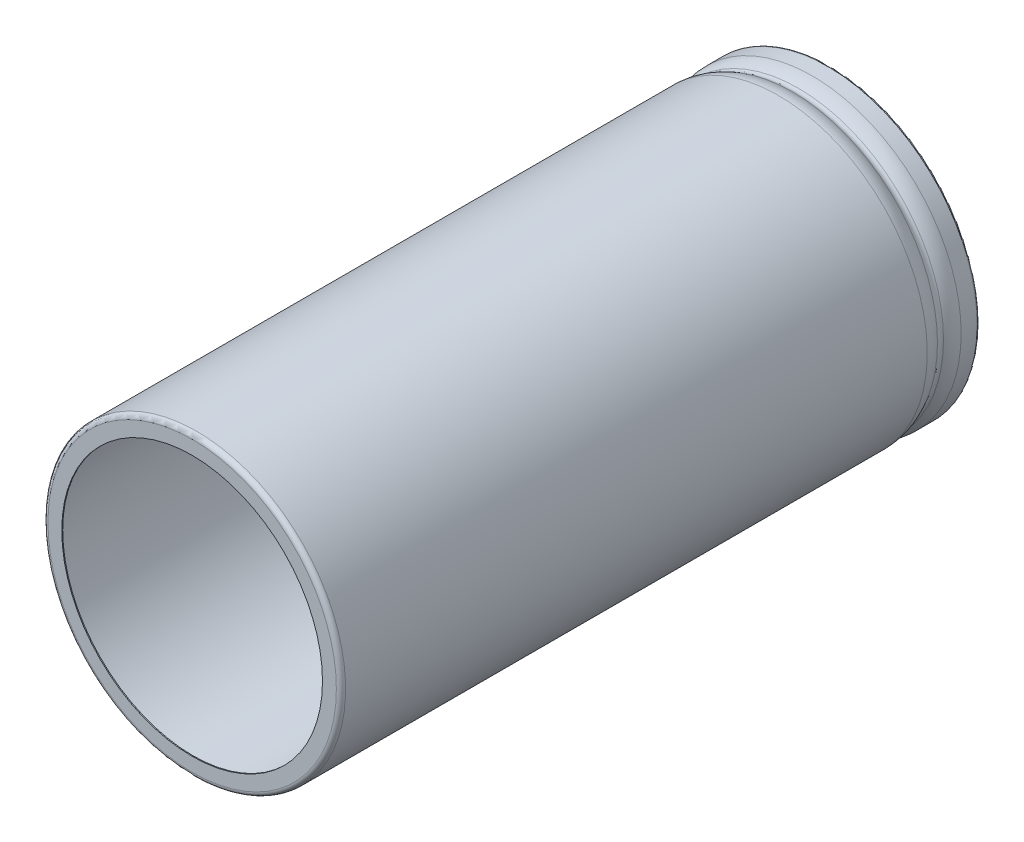
ISO-10303-21;
HEADER;
FILE_DESCRIPTION(('STEP AP214'),'2;1');
FILE_NAME('part.step','',(''),(''),'','','');
FILE_SCHEMA(('AUTOMOTIVE_DESIGN { 1 0 10303 214 1 1 1 1 }'));
ENDSEC;
DATA;
#1=APPLICATION_CONTEXT('core data for automotive mechanical design processes');
#2=APPLICATION_PROTOCOL_DEFINITION('international standard','automotive_design',2000,#1);
#3=PRODUCT_CONTEXT('',#1,'mechanical');
#4=PRODUCT('Part','Part','',(#3));
#5=PRODUCT_RELATED_PRODUCT_CATEGORY('part','',(#4));
#6=PRODUCT_DEFINITION_FORMATION('','',#4);
#7=PRODUCT_DEFINITION_CONTEXT('part definition',#1,'design');
#8=PRODUCT_DEFINITION('design','',#6,#7);
#9=PRODUCT_DEFINITION_SHAPE('','',#8);
#10=(LENGTH_UNIT() NAMED_UNIT(*) SI_UNIT(.MILLI.,.METRE.));
#11=(NAMED_UNIT(*) PLANE_ANGLE_UNIT() SI_UNIT($,.RADIAN.));
#12=(NAMED_UNIT(*) SI_UNIT($,.STERADIAN.) SOLID_ANGLE_UNIT());
#13=UNCERTAINTY_MEASURE_WITH_UNIT(LENGTH_MEASURE(1.E-05),#10,'distance_accuracy_value','');
#14=(GEOMETRIC_REPRESENTATION_CONTEXT(3) GLOBAL_UNCERTAINTY_ASSIGNED_CONTEXT((#13)) GLOBAL_UNIT_ASSIGNED_CONTEXT((#10,
#11,#12)) REPRESENTATION_CONTEXT('',''));
#15=CARTESIAN_POINT('',(0.,0.,0.));
#16=DIRECTION('',(0.,0.,1.));
#17=DIRECTION('',(1.,0.,0.));
#18=AXIS2_PLACEMENT_3D('',#15,#16,#17);
#19=CARTESIAN_POINT('',(0.,16.,-64.4));
#20=CARTESIAN_POINT('',(0.,15.,-65.15));
#21=CARTESIAN_POINT('',(0.,16.,-65.9));
#22=B_SPLINE_CURVE_WITH_KNOTS('',2,(#19,#20,#21),.UNSPECIFIED.,.F.,.F.,(3,3),(0.,1.),.UNSPECIFIED.);
#23=CARTESIAN_POINT('',(0.,0.,0.));
#24=DIRECTION('',(0.,0.,1.));
#25=AXIS1_PLACEMENT('',#23,#24);
#26=SURFACE_OF_REVOLUTION('',#22,#25);
#27=CARTESIAN_POINT('',(0.,0.,-65.4764362746467));
#28=DIRECTION('',(0.,0.,1.));
#29=DIRECTION('',(1.,0.,0.));
#30=AXIS2_PLACEMENT_3D('',#27,#28,#29);
#31=CIRCLE('',#30,15.594720570138);
#32=CARTESIAN_POINT('',(15.594720570138,0.,-65.4764362746467));
#33=VERTEX_POINT('',#32);
#34=EDGE_CURVE('E54',#33,#33,#31,.F.);
#35=ORIENTED_EDGE('',*,*,#34,.T.);
#36=EDGE_LOOP('',(#35));
#37=FACE_BOUND('',#36,.T.);
#38=CARTESIAN_POINT('',(0.,0.,-64.8235637253477));
#39=DIRECTION('',(0.,0.,1.));
#40=DIRECTION('',(1.,0.,0.));
#41=AXIS2_PLACEMENT_3D('',#38,#39,#40);
#42=CIRCLE('',#41,15.5947205701413);
#43=CARTESIAN_POINT('',(15.5947205701413,0.,-64.8235637253477));
#44=VERTEX_POINT('',#43);
#45=EDGE_CURVE('E57',#44,#44,#42,.T.);
#46=ORIENTED_EDGE('',*,*,#45,.T.);
#47=EDGE_LOOP('',(#46));
#48=FACE_BOUND('',#47,.T.);
#49=ADVANCED_FACE('F31',(#37,#48),#26,.T.);
#50=CARTESIAN_POINT('',(0.,0.,0.));
#51=DIRECTION('',(0.,0.,1.));
#52=DIRECTION('',(1.,0.,0.));
#53=AXIS2_PLACEMENT_3D('',#50,#51,#52);
#54=CYLINDRICAL_SURFACE('',#53,16.);
#55=CARTESIAN_POINT('',(0.,0.,-63.317766540171));
#56=DIRECTION('',(0.,0.,1.));
#57=DIRECTION('',(1.,0.,0.));
#58=AXIS2_PLACEMENT_3D('',#55,#56,#57);
#59=CIRCLE('',#58,16.);
#60=CARTESIAN_POINT('',(16.,0.,-63.317766540171));
#61=VERTEX_POINT('',#60);
#62=EDGE_CURVE('E51',#61,#61,#59,.F.);
#63=ORIENTED_EDGE('',*,*,#62,.T.);
#64=EDGE_LOOP('',(#63));
#65=FACE_BOUND('',#64,.T.);
#66=CARTESIAN_POINT('',(0.,0.,-0.500000000000001));
#67=DIRECTION('',(0.,0.,1.));
#68=DIRECTION('',(1.,0.,0.));
#69=AXIS2_PLACEMENT_3D('',#66,#67,#68);
#70=CIRCLE('',#69,16.);
#71=CARTESIAN_POINT('',(16.,0.,-0.500000000000001));
#72=VERTEX_POINT('',#71);
#73=EDGE_CURVE('E72',#72,#72,#70,.T.);
#74=ORIENTED_EDGE('',*,*,#73,.T.);
#75=EDGE_LOOP('',(#74));
#76=FACE_BOUND('',#75,.T.);
#77=ADVANCED_FACE('F131',(#65,#76),#54,.F.);
#78=CARTESIAN_POINT('',(0.,16.,0.));
#79=DIRECTION('',(0.,0.,1.));
#80=DIRECTION('',(1.,0.,0.));
#81=AXIS2_PLACEMENT_3D('',#78,#79,#80);
#82=PLANE('',#81);
#83=CARTESIAN_POINT('',(0.,0.,0.));
#84=DIRECTION('',(0.,0.,1.));
#85=DIRECTION('',(1.,0.,0.));
#86=AXIS2_PLACEMENT_3D('',#83,#84,#85);
#87=CIRCLE('',#86,15.5);
#88=CARTESIAN_POINT('',(15.5,0.,0.));
#89=VERTEX_POINT('',#88);
#90=EDGE_CURVE('E69',#89,#89,#87,.F.);
#91=ORIENTED_EDGE('',*,*,#90,.T.);
#92=EDGE_LOOP('',(#91));
#93=FACE_BOUND('',#92,.T.);
#94=CARTESIAN_POINT('',(0.,0.,0.));
#95=DIRECTION('',(0.,0.,1.));
#96=DIRECTION('',(1.,0.,0.));
#97=AXIS2_PLACEMENT_3D('',#94,#95,#96);
#98=CIRCLE('',#97,14.1);
#99=CARTESIAN_POINT('',(14.1,0.,0.));
#100=VERTEX_POINT('',#99);
#101=EDGE_CURVE('E87',#100,#100,#98,.T.);
#102=ORIENTED_EDGE('',*,*,#101,.T.);
#103=EDGE_LOOP('',(#102));
#104=FACE_BOUND('',#103,.T.);
#105=ADVANCED_FACE('F127',(#93,#104),#82,.F.);
#106=CARTESIAN_POINT('',(0.,0.,0.));
#107=DIRECTION('',(0.,0.,1.));
#108=DIRECTION('',(1.,0.,0.));
#109=AXIS2_PLACEMENT_3D('',#106,#107,#108);
#110=CYLINDRICAL_SURFACE('',#109,14.1);
#111=ORIENTED_EDGE('',*,*,#101,.F.);
#112=EDGE_LOOP('',(#111));
#113=FACE_BOUND('',#112,.T.);
#114=CARTESIAN_POINT('',(0.,0.,0.0999999999999997));
#115=DIRECTION('',(0.,0.,1.));
#116=DIRECTION('',(1.,0.,0.));
#117=AXIS2_PLACEMENT_3D('',#114,#115,#116);
#118=CIRCLE('',#117,14.1);
#119=CARTESIAN_POINT('',(14.1,0.,0.0999999999999997));
#120=VERTEX_POINT('',#119);
#121=EDGE_CURVE('E90',#120,#120,#118,.T.);
#122=ORIENTED_EDGE('',*,*,#121,.T.);
#123=EDGE_LOOP('',(#122));
#124=FACE_BOUND('',#123,.T.);
#125=ADVANCED_FACE('F123',(#113,#124),#110,.F.);
#126=CARTESIAN_POINT('',(0.,14.1,0.0999999999999997));
#127=DIRECTION('',(0.,0.,-1.));
#128=DIRECTION('',(-1.,0.,0.));
#129=AXIS2_PLACEMENT_3D('',#126,#127,#128);
#130=PLANE('',#129);
#131=CARTESIAN_POINT('',(0.,0.,0.0999999999999997));
#132=DIRECTION('',(0.,0.,-1.));
#133=DIRECTION('',(-1.,0.,0.));
#134=AXIS2_PLACEMENT_3D('',#131,#132,#133);
#135=CIRCLE('',#134,15.6);
#136=CARTESIAN_POINT('',(-15.6,0.,0.0999999999999997));
#137=VERTEX_POINT('',#136);
#138=EDGE_CURVE('E66',#137,#137,#135,.F.);
#139=ORIENTED_EDGE('',*,*,#138,.T.);
#140=EDGE_LOOP('',(#139));
#141=FACE_BOUND('',#140,.T.);
#142=ORIENTED_EDGE('',*,*,#121,.F.);
#143=EDGE_LOOP('',(#142));
#144=FACE_BOUND('',#143,.T.);
#145=ADVANCED_FACE('F120',(#141,#144),#130,.F.);
#146=CARTESIAN_POINT('',(0.,0.,0.));
#147=DIRECTION('',(0.,0.,1.));
#148=DIRECTION('',(1.,0.,0.));
#149=AXIS2_PLACEMENT_3D('',#146,#147,#148);
#150=CYLINDRICAL_SURFACE('',#149,16.1);
#151=CARTESIAN_POINT('',(0.,0.,-63.317766540171));
#152=DIRECTION('',(0.,0.,-1.));
#153=DIRECTION('',(-1.,0.,0.));
#154=AXIS2_PLACEMENT_3D('',#151,#152,#153);
#155=CIRCLE('',#154,16.1);
#156=CARTESIAN_POINT('',(-16.1,0.,-63.317766540171));
#157=VERTEX_POINT('',#156);
#158=EDGE_CURVE('E10',#157,#157,#155,.F.);
#159=ORIENTED_EDGE('',*,*,#158,.T.);
#160=EDGE_LOOP('',(#159));
#161=FACE_BOUND('',#160,.T.);
#162=CARTESIAN_POINT('',(0.,0.,-0.4));
#163=DIRECTION('',(0.,0.,-1.));
#164=DIRECTION('',(-1.,0.,0.));
#165=AXIS2_PLACEMENT_3D('',#162,#163,#164);
#166=CIRCLE('',#165,16.1);
#167=CARTESIAN_POINT('',(-16.1,0.,-0.4));
#168=VERTEX_POINT('',#167);
#169=EDGE_CURVE('E63',#168,#168,#166,.T.);
#170=ORIENTED_EDGE('',*,*,#169,.T.);
#171=EDGE_LOOP('',(#170));
#172=FACE_BOUND('',#171,.T.);
#173=ADVANCED_FACE('F115',(#161,#172),#150,.T.);
#174=CARTESIAN_POINT('',(0.,16.1,-65.9));
#175=CARTESIAN_POINT('',(0.,15.1,-65.15));
#176=CARTESIAN_POINT('',(0.,16.1,-64.4));
#177=B_SPLINE_CURVE_WITH_KNOTS('',2,(#174,#175,#176),.UNSPECIFIED.,.F.,.F.,(3,3),(0.,1.),.UNSPECIFIED.);
#178=CARTESIAN_POINT('',(0.,0.,0.));
#179=DIRECTION('',(0.,0.,1.));
#180=AXIS1_PLACEMENT('',#178,#179);
#181=SURFACE_OF_REVOLUTION('',#177,#180);
#182=CARTESIAN_POINT('',(0.,0.,-65.4764362746523));
#183=DIRECTION('',(0.,0.,1.));
#184=DIRECTION('',(1.,0.,0.));
#185=AXIS2_PLACEMENT_3D('',#182,#183,#184);
#186=CIRCLE('',#185,15.6947205701412);
#187=CARTESIAN_POINT('',(15.6947205701412,0.,-65.4764362746523));
#188=VERTEX_POINT('',#187);
#189=EDGE_CURVE('E42',#188,#188,#186,.T.);
#190=ORIENTED_EDGE('',*,*,#189,.T.);
#191=EDGE_LOOP('',(#190));
#192=FACE_BOUND('',#191,.T.);
#193=CARTESIAN_POINT('',(0.,0.,-64.8235637253533));
#194=DIRECTION('',(0.,0.,1.));
#195=DIRECTION('',(1.,0.,0.));
#196=AXIS2_PLACEMENT_3D('',#193,#194,#195);
#197=CIRCLE('',#196,15.694720570138);
#198=CARTESIAN_POINT('',(15.694720570138,0.,-64.8235637253533));
#199=VERTEX_POINT('',#198);
#200=EDGE_CURVE('E46',#199,#199,#197,.F.);
#201=ORIENTED_EDGE('',*,*,#200,.T.);
#202=EDGE_LOOP('',(#201));
#203=FACE_BOUND('',#202,.T.);
#204=ADVANCED_FACE('F110',(#192,#203),#181,.T.);
#205=CARTESIAN_POINT('',(0.,0.,0.));
#206=DIRECTION('',(0.,0.,1.));
#207=DIRECTION('',(1.,0.,0.));
#208=AXIS2_PLACEMENT_3D('',#205,#206,#207);
#209=CYLINDRICAL_SURFACE('',#208,16.1);
#210=CARTESIAN_POINT('',(0.,0.,-66.982233459829));
#211=DIRECTION('',(0.,0.,-1.));
#212=DIRECTION('',(-1.,0.,0.));
#213=AXIS2_PLACEMENT_3D('',#210,#211,#212);
#214=CIRCLE('',#213,16.1);
#215=CARTESIAN_POINT('',(-16.1,0.,-66.982233459829));
#216=VERTEX_POINT('',#215);
#217=EDGE_CURVE('E38',#216,#216,#214,.T.);
#218=ORIENTED_EDGE('',*,*,#217,.T.);
#219=EDGE_LOOP('',(#218));
#220=FACE_BOUND('',#219,.T.);
#221=CARTESIAN_POINT('',(0.,0.,-68.7));
#222=DIRECTION('',(0.,0.,1.));
#223=DIRECTION('',(1.,0.,0.));
#224=AXIS2_PLACEMENT_3D('',#221,#222,#223);
#225=CIRCLE('',#224,16.1);
#226=CARTESIAN_POINT('',(16.1,0.,-68.7));
#227=VERTEX_POINT('',#226);
#228=EDGE_CURVE('E78',#227,#227,#225,.T.);
#229=ORIENTED_EDGE('',*,*,#228,.T.);
#230=EDGE_LOOP('',(#229));
#231=FACE_BOUND('',#230,.T.);
#232=ADVANCED_FACE('F114',(#220,#231),#209,.T.);
#233=CARTESIAN_POINT('',(0.,16.1,-68.95));
#234=DIRECTION('',(0.,0.,1.));
#235=DIRECTION('',(1.,0.,0.));
#236=AXIS2_PLACEMENT_3D('',#233,#234,#235);
#237=PLANE('',#236);
#238=CARTESIAN_POINT('',(0.,0.,-68.95));
#239=DIRECTION('',(0.,0.,1.));
#240=DIRECTION('',(1.,0.,0.));
#241=AXIS2_PLACEMENT_3D('',#238,#239,#240);
#242=CIRCLE('',#241,15.85);
#243=CARTESIAN_POINT('',(15.85,0.,-68.95));
#244=VERTEX_POINT('',#243);
#245=EDGE_CURVE('E75',#244,#244,#242,.F.);
#246=ORIENTED_EDGE('',*,*,#245,.T.);
#247=EDGE_LOOP('',(#246));
#248=FACE_BOUND('',#247,.T.);
#249=CARTESIAN_POINT('',(0.,0.,-68.95));
#250=DIRECTION('',(0.,0.,1.));
#251=DIRECTION('',(1.,0.,0.));
#252=AXIS2_PLACEMENT_3D('',#249,#250,#251);
#253=CIRCLE('',#252,13.1);
#254=CARTESIAN_POINT('',(13.1,0.,-68.95));
#255=VERTEX_POINT('',#254);
#256=EDGE_CURVE('E93',#255,#255,#253,.T.);
#257=ORIENTED_EDGE('',*,*,#256,.T.);
#258=EDGE_LOOP('',(#257));
#259=FACE_BOUND('',#258,.T.);
#260=ADVANCED_FACE('F216',(#248,#259),#237,.F.);
#261=CARTESIAN_POINT('',(0.,0.,0.));
#262=DIRECTION('',(0.,0.,1.));
#263=DIRECTION('',(1.,0.,0.));
#264=AXIS2_PLACEMENT_3D('',#261,#262,#263);
#265=CYLINDRICAL_SURFACE('',#264,13.1);
#266=ORIENTED_EDGE('',*,*,#256,.F.);
#267=EDGE_LOOP('',(#266));
#268=FACE_BOUND('',#267,.T.);
#269=CARTESIAN_POINT('',(0.,0.,-68.9));
#270=DIRECTION('',(0.,0.,1.));
#271=DIRECTION('',(1.,0.,0.));
#272=AXIS2_PLACEMENT_3D('',#269,#270,#271);
#273=CIRCLE('',#272,13.1);
#274=CARTESIAN_POINT('',(13.1,0.,-68.9));
#275=VERTEX_POINT('',#274);
#276=EDGE_CURVE('E96',#275,#275,#273,.T.);
#277=ORIENTED_EDGE('',*,*,#276,.T.);
#278=EDGE_LOOP('',(#277));
#279=FACE_BOUND('',#278,.T.);
#280=ADVANCED_FACE('F283',(#268,#279),#265,.F.);
#281=CARTESIAN_POINT('',(0.,13.1,-68.9));
#282=DIRECTION('',(0.,0.,-1.));
#283=DIRECTION('',(-1.,0.,0.));
#284=AXIS2_PLACEMENT_3D('',#281,#282,#283);
#285=PLANE('',#284);
#286=CARTESIAN_POINT('',(0.,0.,-68.9));
#287=DIRECTION('',(0.,0.,-1.));
#288=DIRECTION('',(-1.,0.,0.));
#289=AXIS2_PLACEMENT_3D('',#286,#287,#288);
#290=CIRCLE('',#289,15.75);
#291=CARTESIAN_POINT('',(-15.75,0.,-68.9));
#292=VERTEX_POINT('',#291);
#293=EDGE_CURVE('E84',#292,#292,#290,.F.);
#294=ORIENTED_EDGE('',*,*,#293,.T.);
#295=EDGE_LOOP('',(#294));
#296=FACE_BOUND('',#295,.T.);
#297=ORIENTED_EDGE('',*,*,#276,.F.);
#298=EDGE_LOOP('',(#297));
#299=FACE_BOUND('',#298,.T.);
#300=ADVANCED_FACE('F203',(#296,#299),#285,.F.);
#301=CARTESIAN_POINT('',(0.,0.,0.));
#302=DIRECTION('',(0.,0.,1.));
#303=DIRECTION('',(1.,0.,0.));
#304=AXIS2_PLACEMENT_3D('',#301,#302,#303);
#305=CYLINDRICAL_SURFACE('',#304,16.);
#306=CARTESIAN_POINT('',(0.,0.,-66.982233459829));
#307=DIRECTION('',(0.,0.,1.));
#308=DIRECTION('',(1.,0.,0.));
#309=AXIS2_PLACEMENT_3D('',#306,#307,#308);
#310=CIRCLE('',#309,16.);
#311=CARTESIAN_POINT('',(16.,0.,-66.982233459829));
#312=VERTEX_POINT('',#311);
#313=EDGE_CURVE('E60',#312,#312,#310,.T.);
#314=ORIENTED_EDGE('',*,*,#313,.T.);
#315=EDGE_LOOP('',(#314));
#316=FACE_BOUND('',#315,.T.);
#317=CARTESIAN_POINT('',(0.,0.,-68.65));
#318=DIRECTION('',(0.,0.,-1.));
#319=DIRECTION('',(-1.,0.,0.));
#320=AXIS2_PLACEMENT_3D('',#317,#318,#319);
#321=CIRCLE('',#320,16.);
#322=CARTESIAN_POINT('',(-16.,0.,-68.65));
#323=VERTEX_POINT('',#322);
#324=EDGE_CURVE('E81',#323,#323,#321,.T.);
#325=ORIENTED_EDGE('',*,*,#324,.T.);
#326=EDGE_LOOP('',(#325));
#327=FACE_BOUND('',#326,.T.);
#328=ADVANCED_FACE('F143',(#316,#327),#305,.F.);
#329=CARTESIAN_POINT('',(0.,0.,-68.65));
#330=DIRECTION('',(0.,0.,-1.));
#331=DIRECTION('',(-1.,0.,0.));
#332=AXIS2_PLACEMENT_3D('',#329,#330,#331);
#333=TOROIDAL_SURFACE('',#332,15.75,0.25);
#334=ORIENTED_EDGE('',*,*,#324,.F.);
#335=EDGE_LOOP('',(#334));
#336=FACE_BOUND('',#335,.T.);
#337=ORIENTED_EDGE('',*,*,#293,.F.);
#338=EDGE_LOOP('',(#337));
#339=FACE_BOUND('',#338,.T.);
#340=ADVANCED_FACE('F139',(#336,#339),#333,.F.);
#341=CARTESIAN_POINT('',(0.,0.,-68.7));
#342=DIRECTION('',(0.,0.,1.));
#343=DIRECTION('',(1.,0.,0.));
#344=AXIS2_PLACEMENT_3D('',#341,#342,#343);
#345=TOROIDAL_SURFACE('',#344,15.85,0.25);
#346=ORIENTED_EDGE('',*,*,#245,.F.);
#347=EDGE_LOOP('',(#346));
#348=FACE_BOUND('',#347,.T.);
#349=ORIENTED_EDGE('',*,*,#228,.F.);
#350=EDGE_LOOP('',(#349));
#351=FACE_BOUND('',#350,.T.);
#352=ADVANCED_FACE('F142',(#348,#351),#345,.T.);
#353=CARTESIAN_POINT('',(0.,0.,-0.500000000000001));
#354=DIRECTION('',(0.,0.,1.));
#355=DIRECTION('',(1.,0.,0.));
#356=AXIS2_PLACEMENT_3D('',#353,#354,#355);
#357=TOROIDAL_SURFACE('',#356,15.5,0.5);
#358=ORIENTED_EDGE('',*,*,#90,.F.);
#359=EDGE_LOOP('',(#358));
#360=FACE_BOUND('',#359,.T.);
#361=ORIENTED_EDGE('',*,*,#73,.F.);
#362=EDGE_LOOP('',(#361));
#363=FACE_BOUND('',#362,.T.);
#364=ADVANCED_FACE('F147',(#360,#363),#357,.F.);
#365=CARTESIAN_POINT('',(0.,0.,-0.4));
#366=DIRECTION('',(0.,0.,-1.));
#367=DIRECTION('',(-1.,0.,0.));
#368=AXIS2_PLACEMENT_3D('',#365,#366,#367);
#369=TOROIDAL_SURFACE('',#368,15.6,0.5);
#370=ORIENTED_EDGE('',*,*,#169,.F.);
#371=EDGE_LOOP('',(#370));
#372=FACE_BOUND('',#371,.T.);
#373=ORIENTED_EDGE('',*,*,#138,.F.);
#374=EDGE_LOOP('',(#373));
#375=FACE_BOUND('',#374,.T.);
#376=ADVANCED_FACE('F151',(#372,#375),#369,.T.);
#377=CARTESIAN_POINT('',(0.,0.,-66.982233459829));
#378=DIRECTION('',(0.,0.,1.));
#379=DIRECTION('',(1.,0.,0.));
#380=AXIS2_PLACEMENT_3D('',#377,#378,#379);
#381=TOROIDAL_SURFACE('',#380,13.,3.);
#382=ORIENTED_EDGE('',*,*,#34,.F.);
#383=EDGE_LOOP('',(#382));
#384=FACE_BOUND('',#383,.T.);
#385=ORIENTED_EDGE('',*,*,#313,.F.);
#386=EDGE_LOOP('',(#385));
#387=FACE_BOUND('',#386,.T.);
#388=ADVANCED_FACE('F155',(#384,#387),#381,.F.);
#389=CARTESIAN_POINT('',(0.,0.,-63.317766540171));
#390=DIRECTION('',(0.,0.,1.));
#391=DIRECTION('',(1.,0.,0.));
#392=AXIS2_PLACEMENT_3D('',#389,#390,#391);
#393=TOROIDAL_SURFACE('',#392,13.,3.);
#394=ORIENTED_EDGE('',*,*,#62,.F.);
#395=EDGE_LOOP('',(#394));
#396=FACE_BOUND('',#395,.T.);
#397=ORIENTED_EDGE('',*,*,#45,.F.);
#398=EDGE_LOOP('',(#397));
#399=FACE_BOUND('',#398,.T.);
#400=ADVANCED_FACE('F159',(#396,#399),#393,.F.);
#401=CARTESIAN_POINT('',(0.,0.,-66.982233459829));
#402=DIRECTION('',(0.,0.,-1.));
#403=DIRECTION('',(-1.,0.,0.));
#404=AXIS2_PLACEMENT_3D('',#401,#402,#403);
#405=TOROIDAL_SURFACE('',#404,13.1,3.);
#406=ORIENTED_EDGE('',*,*,#217,.F.);
#407=EDGE_LOOP('',(#406));
#408=FACE_BOUND('',#407,.T.);
#409=ORIENTED_EDGE('',*,*,#189,.F.);
#410=EDGE_LOOP('',(#409));
#411=FACE_BOUND('',#410,.T.);
#412=ADVANCED_FACE('F162',(#408,#411),#405,.T.);
#413=CARTESIAN_POINT('',(0.,0.,-63.317766540171));
#414=DIRECTION('',(0.,0.,-1.));
#415=DIRECTION('',(-1.,0.,0.));
#416=AXIS2_PLACEMENT_3D('',#413,#414,#415);
#417=TOROIDAL_SURFACE('',#416,13.1,3.);
#418=ORIENTED_EDGE('',*,*,#200,.F.);
#419=EDGE_LOOP('',(#418));
#420=FACE_BOUND('',#419,.T.);
#421=ORIENTED_EDGE('',*,*,#158,.F.);
#422=EDGE_LOOP('',(#421));
#423=FACE_BOUND('',#422,.T.);
#424=ADVANCED_FACE('F33',(#420,#423),#417,.T.);
#425=CLOSED_SHELL('',(#49,#77,#105,#125,#145,#173,#204,#232,#260,#280,#300,#328,#340,#352,#364,
#376,#388,#400,#412,#424));
#426=MANIFOLD_SOLID_BREP('B2',#425);
#427=ADVANCED_BREP_SHAPE_REPRESENTATION('',(#18,#426),#14);
#428=SHAPE_DEFINITION_REPRESENTATION(#9,#427);
ENDSEC;
END-ISO-10303-21;
